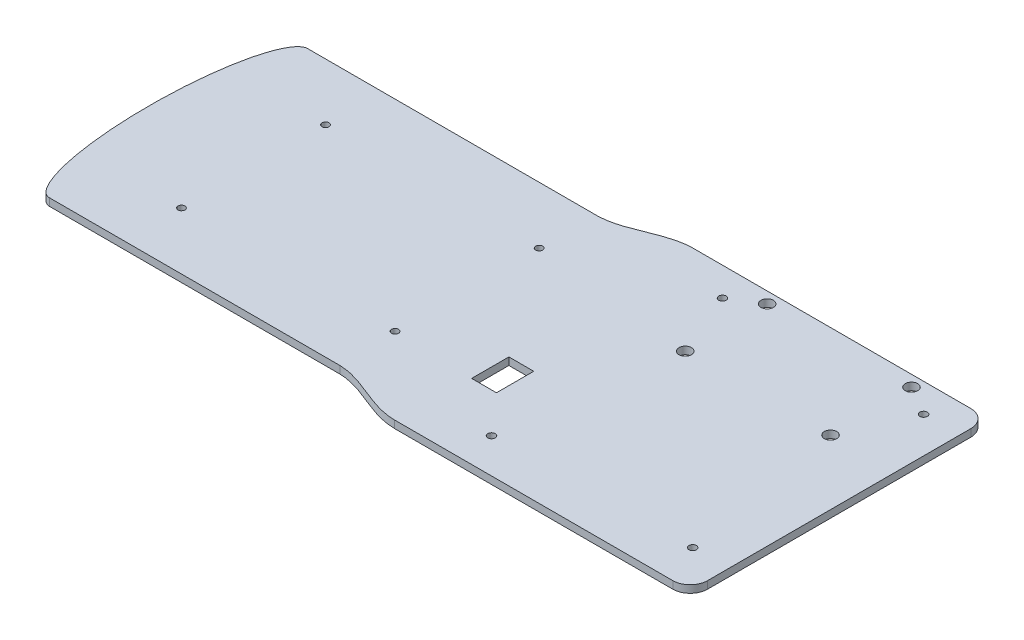
ISO-10303-21;
HEADER;
FILE_DESCRIPTION(('STEP AP214'),'2;1');
FILE_NAME('part.step','',(''),(''),'','','');
FILE_SCHEMA(('AUTOMOTIVE_DESIGN { 1 0 10303 214 1 1 1 1 }'));
ENDSEC;
DATA;
#1=APPLICATION_CONTEXT('core data for automotive mechanical design processes');
#2=APPLICATION_PROTOCOL_DEFINITION('international standard','automotive_design',2000,#1);
#3=PRODUCT_CONTEXT('',#1,'mechanical');
#4=PRODUCT('Part','Part','',(#3));
#5=PRODUCT_RELATED_PRODUCT_CATEGORY('part','',(#4));
#6=PRODUCT_DEFINITION_FORMATION('','',#4);
#7=PRODUCT_DEFINITION_CONTEXT('part definition',#1,'design');
#8=PRODUCT_DEFINITION('design','',#6,#7);
#9=PRODUCT_DEFINITION_SHAPE('','',#8);
#10=(LENGTH_UNIT() NAMED_UNIT(*) SI_UNIT(.MILLI.,.METRE.));
#11=(NAMED_UNIT(*) PLANE_ANGLE_UNIT() SI_UNIT($,.RADIAN.));
#12=(NAMED_UNIT(*) SI_UNIT($,.STERADIAN.) SOLID_ANGLE_UNIT());
#13=UNCERTAINTY_MEASURE_WITH_UNIT(LENGTH_MEASURE(1.E-05),#10,'distance_accuracy_value','');
#14=(GEOMETRIC_REPRESENTATION_CONTEXT(3) GLOBAL_UNCERTAINTY_ASSIGNED_CONTEXT((#13)) GLOBAL_UNIT_ASSIGNED_CONTEXT((#10,
#11,#12)) REPRESENTATION_CONTEXT('',''));
#15=CARTESIAN_POINT('',(0.,0.,0.));
#16=DIRECTION('',(0.,0.,1.));
#17=DIRECTION('',(1.,0.,0.));
#18=AXIS2_PLACEMENT_3D('',#15,#16,#17);
#19=CARTESIAN_POINT('',(139.,3.,-60.));
#20=DIRECTION('',(-1.,0.,0.));
#21=DIRECTION('',(0.,0.,1.));
#22=AXIS2_PLACEMENT_3D('',#19,#20,#21);
#23=PLANE('',#22);
#24=DIRECTION('',(0.,1.,0.));
#25=VECTOR('',#24,1.);
#26=CARTESIAN_POINT('',(139.,0.,-53.));
#27=LINE('',#26,#25);
#28=CARTESIAN_POINT('',(139.,0.,-53.));
#29=VERTEX_POINT('',#28);
#30=CARTESIAN_POINT('',(139.,3.,-53.));
#31=VERTEX_POINT('',#30);
#32=EDGE_CURVE('E203',#29,#31,#27,.T.);
#33=ORIENTED_EDGE('',*,*,#32,.T.);
#34=DIRECTION('',(0.,0.,-1.));
#35=VECTOR('',#34,1.);
#36=CARTESIAN_POINT('',(139.,3.,-60.));
#37=LINE('',#36,#35);
#38=CARTESIAN_POINT('',(139.,3.,53.));
#39=VERTEX_POINT('',#38);
#40=EDGE_CURVE('E313',#39,#31,#37,.T.);
#41=ORIENTED_EDGE('',*,*,#40,.F.);
#42=DIRECTION('',(0.,1.,0.));
#43=VECTOR('',#42,1.);
#44=CARTESIAN_POINT('',(139.,0.,53.));
#45=LINE('',#44,#43);
#46=CARTESIAN_POINT('',(139.,0.,53.));
#47=VERTEX_POINT('',#46);
#48=EDGE_CURVE('E220',#47,#39,#45,.T.);
#49=ORIENTED_EDGE('',*,*,#48,.F.);
#50=DIRECTION('',(0.,0.,-1.));
#51=VECTOR('',#50,1.);
#52=CARTESIAN_POINT('',(139.,0.,-60.));
#53=LINE('',#52,#51);
#54=EDGE_CURVE('E302',#47,#29,#53,.T.);
#55=ORIENTED_EDGE('',*,*,#54,.T.);
#56=EDGE_LOOP('',(#33,#41,#49,#55));
#57=FACE_BOUND('',#56,.T.);
#58=ADVANCED_FACE('F44',(#57),#23,.F.);
#59=CARTESIAN_POINT('',(-139.,3.,60.));
#60=DIRECTION('',(0.,0.,-1.));
#61=DIRECTION('',(-1.,0.,0.));
#62=AXIS2_PLACEMENT_3D('',#59,#60,#61);
#63=PLANE('',#62);
#64=DIRECTION('',(0.,1.,0.));
#65=VECTOR('',#64,1.);
#66=CARTESIAN_POINT('',(132.,0.,60.));
#67=LINE('',#66,#65);
#68=CARTESIAN_POINT('',(132.,0.,60.));
#69=VERTEX_POINT('',#68);
#70=CARTESIAN_POINT('',(132.,3.,60.));
#71=VERTEX_POINT('',#70);
#72=EDGE_CURVE('E215',#69,#71,#67,.T.);
#73=ORIENTED_EDGE('',*,*,#72,.T.);
#74=DIRECTION('',(1.,0.,0.));
#75=VECTOR('',#74,1.);
#76=CARTESIAN_POINT('',(-139.,3.,60.));
#77=LINE('',#76,#75);
#78=CARTESIAN_POINT('',(20.,3.,60.));
#79=VERTEX_POINT('',#78);
#80=EDGE_CURVE('E321',#79,#71,#77,.T.);
#81=ORIENTED_EDGE('',*,*,#80,.F.);
#82=DIRECTION('',(0.,1.,0.));
#83=VECTOR('',#82,1.);
#84=CARTESIAN_POINT('',(20.,0.,60.));
#85=LINE('',#84,#83);
#86=CARTESIAN_POINT('',(20.,0.,60.));
#87=VERTEX_POINT('',#86);
#88=EDGE_CURVE('E211',#87,#79,#85,.T.);
#89=ORIENTED_EDGE('',*,*,#88,.F.);
#90=DIRECTION('',(1.,0.,0.));
#91=VECTOR('',#90,1.);
#92=CARTESIAN_POINT('',(-139.,0.,60.));
#93=LINE('',#92,#91);
#94=EDGE_CURVE('E318',#87,#69,#93,.T.);
#95=ORIENTED_EDGE('',*,*,#94,.T.);
#96=EDGE_LOOP('',(#73,#81,#89,#95));
#97=FACE_BOUND('',#96,.T.);
#98=ADVANCED_FACE('F426',(#97),#63,.F.);
#99=CARTESIAN_POINT('',(0.,3.,0.));
#100=DIRECTION('',(0.,1.,0.));
#101=DIRECTION('',(0.,0.,1.));
#102=AXIS2_PLACEMENT_3D('',#99,#100,#101);
#103=PLANE('',#102);
#104=CARTESIAN_POINT('',(43.5000000000002,3.,-48.5));
#105=DIRECTION('',(0.,1.,0.));
#106=DIRECTION('',(0.,0.,1.));
#107=AXIS2_PLACEMENT_3D('',#104,#105,#106);
#108=CIRCLE('',#107,1.5);
#109=CARTESIAN_POINT('',(43.5000000000002,3.,-47.));
#110=VERTEX_POINT('',#109);
#111=EDGE_CURVE('E401',#110,#110,#108,.T.);
#112=ORIENTED_EDGE('',*,*,#111,.F.);
#113=EDGE_LOOP('',(#112));
#114=FACE_BOUND('',#113,.T.);
#115=CARTESIAN_POINT('',(45.0000000000002,3.,46.));
#116=DIRECTION('',(0.,1.,0.));
#117=DIRECTION('',(0.,0.,1.));
#118=AXIS2_PLACEMENT_3D('',#115,#116,#117);
#119=CIRCLE('',#118,1.5);
#120=CARTESIAN_POINT('',(45.0000000000002,3.,47.5));
#121=VERTEX_POINT('',#120);
#122=EDGE_CURVE('E388',#121,#121,#119,.T.);
#123=ORIENTED_EDGE('',*,*,#122,.F.);
#124=EDGE_LOOP('',(#123));
#125=FACE_BOUND('',#124,.T.);
#126=CARTESIAN_POINT('',(113.,3.,-22.5));
#127=DIRECTION('',(0.,1.,0.));
#128=DIRECTION('',(0.,0.,1.));
#129=AXIS2_PLACEMENT_3D('',#126,#127,#128);
#130=CIRCLE('',#129,2.5);
#131=CARTESIAN_POINT('',(113.,3.,-20.));
#132=VERTEX_POINT('',#131);
#133=EDGE_CURVE('E381',#132,#132,#130,.T.);
#134=ORIENTED_EDGE('',*,*,#133,.F.);
#135=EDGE_LOOP('',(#134));
#136=FACE_BOUND('',#135,.T.);
#137=CARTESIAN_POINT('',(54.5000000000002,3.,-22.5));
#138=DIRECTION('',(0.,1.,0.));
#139=DIRECTION('',(0.,0.,1.));
#140=AXIS2_PLACEMENT_3D('',#137,#138,#139);
#141=CIRCLE('',#140,2.5);
#142=CARTESIAN_POINT('',(54.5000000000002,3.,-20.));
#143=VERTEX_POINT('',#142);
#144=EDGE_CURVE('E387',#143,#143,#141,.T.);
#145=ORIENTED_EDGE('',*,*,#144,.F.);
#146=EDGE_LOOP('',(#145));
#147=FACE_BOUND('',#146,.T.);
#148=CARTESIAN_POINT('',(54.5000000000002,3.,-55.5));
#149=DIRECTION('',(0.,1.,0.));
#150=DIRECTION('',(0.,0.,1.));
#151=AXIS2_PLACEMENT_3D('',#148,#149,#150);
#152=CIRCLE('',#151,2.5);
#153=CARTESIAN_POINT('',(54.5000000000002,3.,-53.));
#154=VERTEX_POINT('',#153);
#155=EDGE_CURVE('E375',#154,#154,#152,.T.);
#156=ORIENTED_EDGE('',*,*,#155,.F.);
#157=EDGE_LOOP('',(#156));
#158=FACE_BOUND('',#157,.T.);
#159=CARTESIAN_POINT('',(124.5,3.,44.5));
#160=DIRECTION('',(0.,1.,0.));
#161=DIRECTION('',(0.,0.,1.));
#162=AXIS2_PLACEMENT_3D('',#159,#160,#161);
#163=CIRCLE('',#162,1.49999999999998);
#164=CARTESIAN_POINT('',(124.5,3.,46.));
#165=VERTEX_POINT('',#164);
#166=EDGE_CURVE('E370',#165,#165,#163,.T.);
#167=ORIENTED_EDGE('',*,*,#166,.F.);
#168=EDGE_LOOP('',(#167));
#169=FACE_BOUND('',#168,.T.);
#170=CARTESIAN_POINT('',(124.5,3.,-48.5));
#171=DIRECTION('',(0.,1.,0.));
#172=DIRECTION('',(0.,0.,1.));
#173=AXIS2_PLACEMENT_3D('',#170,#171,#172);
#174=CIRCLE('',#173,1.49999999999998);
#175=CARTESIAN_POINT('',(124.5,3.,-47.));
#176=VERTEX_POINT('',#175);
#177=EDGE_CURVE('E365',#176,#176,#174,.T.);
#178=ORIENTED_EDGE('',*,*,#177,.F.);
#179=EDGE_LOOP('',(#178));
#180=FACE_BOUND('',#179,.T.);
#181=CARTESIAN_POINT('',(112.6,3.,-55.5));
#182=DIRECTION('',(0.,1.,0.));
#183=DIRECTION('',(0.,0.,1.));
#184=AXIS2_PLACEMENT_3D('',#181,#182,#183);
#185=CIRCLE('',#184,2.5);
#186=CARTESIAN_POINT('',(112.6,3.,-53.));
#187=VERTEX_POINT('',#186);
#188=EDGE_CURVE('E360',#187,#187,#185,.T.);
#189=ORIENTED_EDGE('',*,*,#188,.F.);
#190=EDGE_LOOP('',(#189));
#191=FACE_BOUND('',#190,.T.);
#192=DIRECTION('',(0.,0.,1.));
#193=VECTOR('',#192,1.);
#194=CARTESIAN_POINT('',(21.0000000000002,3.,15.));
#195=LINE('',#194,#193);
#196=CARTESIAN_POINT('',(21.0000000000002,3.,15.));
#197=VERTEX_POINT('',#196);
#198=CARTESIAN_POINT('',(21.0000000000002,3.,30.));
#199=VERTEX_POINT('',#198);
#200=EDGE_CURVE('E61',#197,#199,#195,.T.);
#201=ORIENTED_EDGE('',*,*,#200,.F.);
#202=DIRECTION('',(-1.,0.,0.));
#203=VECTOR('',#202,1.);
#204=CARTESIAN_POINT('',(21.0000000000002,3.,15.));
#205=LINE('',#204,#203);
#206=CARTESIAN_POINT('',(31.0000000000002,3.,15.));
#207=VERTEX_POINT('',#206);
#208=EDGE_CURVE('E168',#207,#197,#205,.T.);
#209=ORIENTED_EDGE('',*,*,#208,.F.);
#210=DIRECTION('',(0.,0.,-1.));
#211=VECTOR('',#210,1.);
#212=CARTESIAN_POINT('',(31.0000000000002,3.,15.));
#213=LINE('',#212,#211);
#214=CARTESIAN_POINT('',(31.0000000000002,3.,30.));
#215=VERTEX_POINT('',#214);
#216=EDGE_CURVE('E150',#215,#207,#213,.T.);
#217=ORIENTED_EDGE('',*,*,#216,.F.);
#218=DIRECTION('',(1.,0.,0.));
#219=VECTOR('',#218,1.);
#220=CARTESIAN_POINT('',(21.0000000000002,3.,30.));
#221=LINE('',#220,#219);
#222=EDGE_CURVE('E160',#199,#215,#221,.T.);
#223=ORIENTED_EDGE('',*,*,#222,.F.);
#224=EDGE_LOOP('',(#201,#209,#217,#223));
#225=FACE_BOUND('',#224,.T.);
#226=CARTESIAN_POINT('',(-96.85109,3.,28.96802));
#227=DIRECTION('',(0.,1.,0.));
#228=DIRECTION('',(0.,0.,1.));
#229=AXIS2_PLACEMENT_3D('',#226,#227,#228);
#230=CIRCLE('',#229,1.39979);
#231=CARTESIAN_POINT('',(-96.85109,3.,30.36781));
#232=VERTEX_POINT('',#231);
#233=EDGE_CURVE('E187',#232,#232,#230,.T.);
#234=ORIENTED_EDGE('',*,*,#233,.F.);
#235=EDGE_LOOP('',(#234));
#236=FACE_BOUND('',#235,.T.);
#237=CARTESIAN_POINT('',(-10.85223,3.,-29.03265));
#238=DIRECTION('',(0.,1.,0.));
#239=DIRECTION('',(0.,0.,1.));
#240=AXIS2_PLACEMENT_3D('',#237,#238,#239);
#241=CIRCLE('',#240,1.39979);
#242=CARTESIAN_POINT('',(-10.85223,3.,-27.63286));
#243=VERTEX_POINT('',#242);
#244=EDGE_CURVE('E186',#243,#243,#241,.T.);
#245=ORIENTED_EDGE('',*,*,#244,.F.);
#246=EDGE_LOOP('',(#245));
#247=FACE_BOUND('',#246,.T.);
#248=CARTESIAN_POINT('',(-10.8511,3.,28.96784));
#249=DIRECTION('',(0.,1.,0.));
#250=DIRECTION('',(0.,0.,1.));
#251=AXIS2_PLACEMENT_3D('',#248,#249,#250);
#252=CIRCLE('',#251,1.39979);
#253=CARTESIAN_POINT('',(-10.8511,3.,30.36763));
#254=VERTEX_POINT('',#253);
#255=EDGE_CURVE('E178',#254,#254,#252,.T.);
#256=ORIENTED_EDGE('',*,*,#255,.F.);
#257=EDGE_LOOP('',(#256));
#258=FACE_BOUND('',#257,.T.);
#259=CARTESIAN_POINT('',(-96.85129,3.,-29.0311));
#260=DIRECTION('',(0.,1.,0.));
#261=DIRECTION('',(0.,0.,1.));
#262=AXIS2_PLACEMENT_3D('',#259,#260,#261);
#263=CIRCLE('',#262,1.39978999999999);
#264=CARTESIAN_POINT('',(-96.85129,3.,-27.63131));
#265=VERTEX_POINT('',#264);
#266=EDGE_CURVE('E191',#265,#265,#263,.T.);
#267=ORIENTED_EDGE('',*,*,#266,.F.);
#268=EDGE_LOOP('',(#267));
#269=FACE_BOUND('',#268,.T.);
#270=CARTESIAN_POINT('',(132.,3.,-53.));
#271=DIRECTION('',(0.,-1.,0.));
#272=DIRECTION('',(0.,0.,1.));
#273=AXIS2_PLACEMENT_3D('',#270,#271,#272);
#274=CIRCLE('',#273,7.00000000000001);
#275=CARTESIAN_POINT('',(132.,3.,-60.));
#276=VERTEX_POINT('',#275);
#277=EDGE_CURVE('E204',#276,#31,#274,.T.);
#278=ORIENTED_EDGE('',*,*,#277,.F.);
#279=DIRECTION('',(-1.,0.,0.));
#280=VECTOR('',#279,1.);
#281=CARTESIAN_POINT('',(-139.,3.,-60.));
#282=LINE('',#281,#280);
#283=CARTESIAN_POINT('',(20.,3.,-60.));
#284=VERTEX_POINT('',#283);
#285=EDGE_CURVE('E317',#276,#284,#282,.T.);
#286=ORIENTED_EDGE('',*,*,#285,.T.);
#287=CARTESIAN_POINT('',(-10.,3.,-52.));
#288=CARTESIAN_POINT('',(0.641218660403758,3.,-52.3672232546946));
#289=CARTESIAN_POINT('',(9.37669372133116,3.,-59.9199275905151));
#290=CARTESIAN_POINT('',(20.,3.,-60.));
#291=B_SPLINE_CURVE_WITH_KNOTS('',3,(#287,#288,#289,#290),.UNSPECIFIED.,.F.,.F.,(4,4),(0.,1.),.UNSPECIFIED.);
#292=CARTESIAN_POINT('',(-10.,3.,-52.));
#293=VERTEX_POINT('',#292);
#294=EDGE_CURVE('E237',#293,#284,#291,.T.);
#295=ORIENTED_EDGE('',*,*,#294,.F.);
#296=DIRECTION('',(1.,0.,0.));
#297=VECTOR('',#296,1.);
#298=CARTESIAN_POINT('',(-10.,3.,-52.));
#299=LINE('',#298,#297);
#300=CARTESIAN_POINT('',(-127.,3.,-52.));
#301=VERTEX_POINT('',#300);
#302=EDGE_CURVE('E295',#301,#293,#299,.T.);
#303=ORIENTED_EDGE('',*,*,#302,.F.);
#304=CARTESIAN_POINT('',(-127.,3.,0.));
#305=DIRECTION('',(0.,1.,0.));
#306=DIRECTION('',(0.,0.,1.));
#307=AXIS2_PLACEMENT_3D('',#304,#305,#306);
#308=ELLIPSE('',#307,52.,12.);
#309=CARTESIAN_POINT('',(-127.,3.,52.));
#310=VERTEX_POINT('',#309);
#311=EDGE_CURVE('E278',#301,#310,#308,.T.);
#312=ORIENTED_EDGE('',*,*,#311,.T.);
#313=DIRECTION('',(-1.,0.,0.));
#314=VECTOR('',#313,1.);
#315=CARTESIAN_POINT('',(-139.,3.,52.));
#316=LINE('',#315,#314);
#317=CARTESIAN_POINT('',(-10.,3.,52.));
#318=VERTEX_POINT('',#317);
#319=EDGE_CURVE('E299',#318,#310,#316,.T.);
#320=ORIENTED_EDGE('',*,*,#319,.F.);
#321=CARTESIAN_POINT('',(20.,3.,60.));
#322=CARTESIAN_POINT('',(9.37669372133118,3.,59.9199275905152));
#323=CARTESIAN_POINT('',(0.641218660403772,3.,52.3672232546946));
#324=CARTESIAN_POINT('',(-10.,3.,52.));
#325=B_SPLINE_CURVE_WITH_KNOTS('',3,(#321,#322,#323,#324),.UNSPECIFIED.,.F.,.F.,(4,4),(0.,1.),.UNSPECIFIED.);
#326=EDGE_CURVE('E268',#79,#318,#325,.T.);
#327=ORIENTED_EDGE('',*,*,#326,.F.);
#328=ORIENTED_EDGE('',*,*,#80,.T.);
#329=CARTESIAN_POINT('',(132.,3.,53.));
#330=DIRECTION('',(0.,-1.,0.));
#331=DIRECTION('',(0.,0.,-1.));
#332=AXIS2_PLACEMENT_3D('',#329,#330,#331);
#333=CIRCLE('',#332,7.00000000000001);
#334=EDGE_CURVE('E207',#39,#71,#333,.T.);
#335=ORIENTED_EDGE('',*,*,#334,.F.);
#336=ORIENTED_EDGE('',*,*,#40,.T.);
#337=EDGE_LOOP('',(#278,#286,#295,#303,#312,#320,#327,#328,#335,#336));
#338=FACE_BOUND('',#337,.T.);
#339=ADVANCED_FACE('F165',(#114,#125,#136,#147,#158,#169,#180,#191,#225,#236,#247,#258,#269,
#338),#103,.T.);
#340=CARTESIAN_POINT('',(0.,0.,0.));
#341=DIRECTION('',(0.,1.,0.));
#342=DIRECTION('',(0.,0.,1.));
#343=AXIS2_PLACEMENT_3D('',#340,#341,#342);
#344=PLANE('',#343);
#345=CARTESIAN_POINT('',(43.5000000000002,0.,-48.5));
#346=DIRECTION('',(0.,1.,0.));
#347=DIRECTION('',(0.,0.,1.));
#348=AXIS2_PLACEMENT_3D('',#345,#346,#347);
#349=CIRCLE('',#348,1.5);
#350=CARTESIAN_POINT('',(43.5000000000002,0.,-47.));
#351=VERTEX_POINT('',#350);
#352=EDGE_CURVE('E47',#351,#351,#349,.T.);
#353=ORIENTED_EDGE('',*,*,#352,.T.);
#354=EDGE_LOOP('',(#353));
#355=FACE_BOUND('',#354,.T.);
#356=CARTESIAN_POINT('',(45.0000000000002,0.,46.));
#357=DIRECTION('',(0.,1.,0.));
#358=DIRECTION('',(0.,0.,1.));
#359=AXIS2_PLACEMENT_3D('',#356,#357,#358);
#360=CIRCLE('',#359,1.5);
#361=CARTESIAN_POINT('',(45.0000000000002,0.,47.5));
#362=VERTEX_POINT('',#361);
#363=EDGE_CURVE('E384',#362,#362,#360,.T.);
#364=ORIENTED_EDGE('',*,*,#363,.T.);
#365=EDGE_LOOP('',(#364));
#366=FACE_BOUND('',#365,.T.);
#367=CARTESIAN_POINT('',(113.,0.,-22.5));
#368=DIRECTION('',(0.,1.,0.));
#369=DIRECTION('',(0.,0.,1.));
#370=AXIS2_PLACEMENT_3D('',#367,#368,#369);
#371=CIRCLE('',#370,2.5);
#372=CARTESIAN_POINT('',(113.,0.,-20.));
#373=VERTEX_POINT('',#372);
#374=EDGE_CURVE('E380',#373,#373,#371,.T.);
#375=ORIENTED_EDGE('',*,*,#374,.T.);
#376=EDGE_LOOP('',(#375));
#377=FACE_BOUND('',#376,.T.);
#378=CARTESIAN_POINT('',(54.5000000000002,0.,-22.5));
#379=DIRECTION('',(0.,1.,0.));
#380=DIRECTION('',(0.,0.,1.));
#381=AXIS2_PLACEMENT_3D('',#378,#379,#380);
#382=CIRCLE('',#381,2.5);
#383=CARTESIAN_POINT('',(54.5000000000002,0.,-20.));
#384=VERTEX_POINT('',#383);
#385=EDGE_CURVE('E376',#384,#384,#382,.T.);
#386=ORIENTED_EDGE('',*,*,#385,.T.);
#387=EDGE_LOOP('',(#386));
#388=FACE_BOUND('',#387,.T.);
#389=CARTESIAN_POINT('',(54.5000000000002,0.,-55.5));
#390=DIRECTION('',(0.,1.,0.));
#391=DIRECTION('',(0.,0.,1.));
#392=AXIS2_PLACEMENT_3D('',#389,#390,#391);
#393=CIRCLE('',#392,2.5);
#394=CARTESIAN_POINT('',(54.5000000000002,0.,-53.));
#395=VERTEX_POINT('',#394);
#396=EDGE_CURVE('E371',#395,#395,#393,.T.);
#397=ORIENTED_EDGE('',*,*,#396,.T.);
#398=EDGE_LOOP('',(#397));
#399=FACE_BOUND('',#398,.T.);
#400=CARTESIAN_POINT('',(124.5,0.,44.5));
#401=DIRECTION('',(0.,1.,0.));
#402=DIRECTION('',(0.,0.,1.));
#403=AXIS2_PLACEMENT_3D('',#400,#401,#402);
#404=CIRCLE('',#403,1.49999999999998);
#405=CARTESIAN_POINT('',(124.5,0.,46.));
#406=VERTEX_POINT('',#405);
#407=EDGE_CURVE('E366',#406,#406,#404,.T.);
#408=ORIENTED_EDGE('',*,*,#407,.T.);
#409=EDGE_LOOP('',(#408));
#410=FACE_BOUND('',#409,.T.);
#411=CARTESIAN_POINT('',(124.5,0.,-48.5));
#412=DIRECTION('',(0.,1.,0.));
#413=DIRECTION('',(0.,0.,1.));
#414=AXIS2_PLACEMENT_3D('',#411,#412,#413);
#415=CIRCLE('',#414,1.49999999999998);
#416=CARTESIAN_POINT('',(124.5,0.,-47.));
#417=VERTEX_POINT('',#416);
#418=EDGE_CURVE('E361',#417,#417,#415,.T.);
#419=ORIENTED_EDGE('',*,*,#418,.T.);
#420=EDGE_LOOP('',(#419));
#421=FACE_BOUND('',#420,.T.);
#422=CARTESIAN_POINT('',(112.6,0.,-55.5));
#423=DIRECTION('',(0.,1.,0.));
#424=DIRECTION('',(0.,0.,1.));
#425=AXIS2_PLACEMENT_3D('',#422,#423,#424);
#426=CIRCLE('',#425,2.5);
#427=CARTESIAN_POINT('',(112.6,0.,-53.));
#428=VERTEX_POINT('',#427);
#429=EDGE_CURVE('E356',#428,#428,#426,.T.);
#430=ORIENTED_EDGE('',*,*,#429,.T.);
#431=EDGE_LOOP('',(#430));
#432=FACE_BOUND('',#431,.T.);
#433=DIRECTION('',(-1.,0.,0.));
#434=VECTOR('',#433,1.);
#435=CARTESIAN_POINT('',(0.,0.,15.));
#436=LINE('',#435,#434);
#437=CARTESIAN_POINT('',(31.0000000000002,0.,15.));
#438=VERTEX_POINT('',#437);
#439=CARTESIAN_POINT('',(21.0000000000002,0.,15.));
#440=VERTEX_POINT('',#439);
#441=EDGE_CURVE('E53',#438,#440,#436,.T.);
#442=ORIENTED_EDGE('',*,*,#441,.T.);
#443=DIRECTION('',(0.,0.,1.));
#444=VECTOR('',#443,1.);
#445=CARTESIAN_POINT('',(21.0000000000002,0.,0.));
#446=LINE('',#445,#444);
#447=CARTESIAN_POINT('',(21.0000000000002,0.,30.));
#448=VERTEX_POINT('',#447);
#449=EDGE_CURVE('E11',#440,#448,#446,.T.);
#450=ORIENTED_EDGE('',*,*,#449,.T.);
#451=DIRECTION('',(1.,0.,0.));
#452=VECTOR('',#451,1.);
#453=CARTESIAN_POINT('',(0.,0.,30.));
#454=LINE('',#453,#452);
#455=CARTESIAN_POINT('',(31.0000000000002,0.,30.));
#456=VERTEX_POINT('',#455);
#457=EDGE_CURVE('E325',#448,#456,#454,.T.);
#458=ORIENTED_EDGE('',*,*,#457,.T.);
#459=DIRECTION('',(0.,0.,-1.));
#460=VECTOR('',#459,1.);
#461=CARTESIAN_POINT('',(31.0000000000002,0.,0.));
#462=LINE('',#461,#460);
#463=EDGE_CURVE('E153',#456,#438,#462,.T.);
#464=ORIENTED_EDGE('',*,*,#463,.T.);
#465=EDGE_LOOP('',(#442,#450,#458,#464));
#466=FACE_BOUND('',#465,.T.);
#467=CARTESIAN_POINT('',(-96.85109,0.,28.96802));
#468=DIRECTION('',(0.,1.,0.));
#469=DIRECTION('',(0.,0.,1.));
#470=AXIS2_PLACEMENT_3D('',#467,#468,#469);
#471=CIRCLE('',#470,1.39979);
#472=CARTESIAN_POINT('',(-96.85109,0.,30.36781));
#473=VERTEX_POINT('',#472);
#474=EDGE_CURVE('E223',#473,#473,#471,.T.);
#475=ORIENTED_EDGE('',*,*,#474,.T.);
#476=EDGE_LOOP('',(#475));
#477=FACE_BOUND('',#476,.T.);
#478=CARTESIAN_POINT('',(-10.85223,0.,-29.03265));
#479=DIRECTION('',(0.,1.,0.));
#480=DIRECTION('',(0.,0.,1.));
#481=AXIS2_PLACEMENT_3D('',#478,#479,#480);
#482=CIRCLE('',#481,1.39979);
#483=CARTESIAN_POINT('',(-10.85223,0.,-27.63286));
#484=VERTEX_POINT('',#483);
#485=EDGE_CURVE('E342',#484,#484,#482,.T.);
#486=ORIENTED_EDGE('',*,*,#485,.T.);
#487=EDGE_LOOP('',(#486));
#488=FACE_BOUND('',#487,.T.);
#489=CARTESIAN_POINT('',(-10.8511,0.,28.96784));
#490=DIRECTION('',(0.,1.,0.));
#491=DIRECTION('',(0.,0.,1.));
#492=AXIS2_PLACEMENT_3D('',#489,#490,#491);
#493=CIRCLE('',#492,1.39979);
#494=CARTESIAN_POINT('',(-10.8511,0.,30.36763));
#495=VERTEX_POINT('',#494);
#496=EDGE_CURVE('E338',#495,#495,#493,.T.);
#497=ORIENTED_EDGE('',*,*,#496,.T.);
#498=EDGE_LOOP('',(#497));
#499=FACE_BOUND('',#498,.T.);
#500=CARTESIAN_POINT('',(-96.85129,0.,-29.0311));
#501=DIRECTION('',(0.,1.,0.));
#502=DIRECTION('',(0.,0.,1.));
#503=AXIS2_PLACEMENT_3D('',#500,#501,#502);
#504=CIRCLE('',#503,1.39978999999999);
#505=CARTESIAN_POINT('',(-96.85129,0.,-27.63131));
#506=VERTEX_POINT('',#505);
#507=EDGE_CURVE('E198',#506,#506,#504,.T.);
#508=ORIENTED_EDGE('',*,*,#507,.T.);
#509=EDGE_LOOP('',(#508));
#510=FACE_BOUND('',#509,.T.);
#511=DIRECTION('',(-1.,0.,0.));
#512=VECTOR('',#511,1.);
#513=CARTESIAN_POINT('',(-139.,0.,-60.));
#514=LINE('',#513,#512);
#515=CARTESIAN_POINT('',(132.,0.,-60.));
#516=VERTEX_POINT('',#515);
#517=CARTESIAN_POINT('',(20.,0.,-60.));
#518=VERTEX_POINT('',#517);
#519=EDGE_CURVE('E329',#516,#518,#514,.T.);
#520=ORIENTED_EDGE('',*,*,#519,.F.);
#521=CARTESIAN_POINT('',(132.,0.,-53.));
#522=DIRECTION('',(0.,-1.,0.));
#523=DIRECTION('',(0.,0.,1.));
#524=AXIS2_PLACEMENT_3D('',#521,#522,#523);
#525=CIRCLE('',#524,7.00000000000001);
#526=EDGE_CURVE('E199',#516,#29,#525,.T.);
#527=ORIENTED_EDGE('',*,*,#526,.T.);
#528=ORIENTED_EDGE('',*,*,#54,.F.);
#529=CARTESIAN_POINT('',(132.,0.,53.));
#530=DIRECTION('',(0.,-1.,0.));
#531=DIRECTION('',(0.,0.,-1.));
#532=AXIS2_PLACEMENT_3D('',#529,#530,#531);
#533=CIRCLE('',#532,7.00000000000001);
#534=EDGE_CURVE('E219',#47,#69,#533,.T.);
#535=ORIENTED_EDGE('',*,*,#534,.T.);
#536=ORIENTED_EDGE('',*,*,#94,.F.);
#537=CARTESIAN_POINT('',(20.,0.,60.));
#538=CARTESIAN_POINT('',(9.37669372133118,0.,59.9199275905152));
#539=CARTESIAN_POINT('',(0.641218660403772,0.,52.3672232546946));
#540=CARTESIAN_POINT('',(-10.,0.,52.));
#541=B_SPLINE_CURVE_WITH_KNOTS('',3,(#537,#538,#539,#540),.UNSPECIFIED.,.F.,.F.,(4,4),(0.,1.),.UNSPECIFIED.);
#542=CARTESIAN_POINT('',(-10.,0.,52.));
#543=VERTEX_POINT('',#542);
#544=EDGE_CURVE('E260',#87,#543,#541,.T.);
#545=ORIENTED_EDGE('',*,*,#544,.T.);
#546=DIRECTION('',(-1.,0.,0.));
#547=VECTOR('',#546,1.);
#548=CARTESIAN_POINT('',(-139.,0.,52.));
#549=LINE('',#548,#547);
#550=CARTESIAN_POINT('',(-127.,0.,52.));
#551=VERTEX_POINT('',#550);
#552=EDGE_CURVE('E306',#543,#551,#549,.T.);
#553=ORIENTED_EDGE('',*,*,#552,.T.);
#554=CARTESIAN_POINT('',(-127.,0.,0.));
#555=DIRECTION('',(0.,1.,0.));
#556=DIRECTION('',(0.,0.,1.));
#557=AXIS2_PLACEMENT_3D('',#554,#555,#556);
#558=ELLIPSE('',#557,52.,12.);
#559=CARTESIAN_POINT('',(-127.,0.,-52.));
#560=VERTEX_POINT('',#559);
#561=EDGE_CURVE('E279',#560,#551,#558,.T.);
#562=ORIENTED_EDGE('',*,*,#561,.F.);
#563=DIRECTION('',(1.,0.,0.));
#564=VECTOR('',#563,1.);
#565=CARTESIAN_POINT('',(-10.,0.,-52.));
#566=LINE('',#565,#564);
#567=CARTESIAN_POINT('',(-10.,0.,-52.));
#568=VERTEX_POINT('',#567);
#569=EDGE_CURVE('E290',#560,#568,#566,.T.);
#570=ORIENTED_EDGE('',*,*,#569,.T.);
#571=CARTESIAN_POINT('',(-10.,0.,-52.));
#572=CARTESIAN_POINT('',(0.641218660403758,0.,-52.3672232546946));
#573=CARTESIAN_POINT('',(9.37669372133116,0.,-59.9199275905151));
#574=CARTESIAN_POINT('',(20.,0.,-60.));
#575=B_SPLINE_CURVE_WITH_KNOTS('',3,(#571,#572,#573,#574),.UNSPECIFIED.,.F.,.F.,(4,4),(0.,1.),.UNSPECIFIED.);
#576=EDGE_CURVE('E229',#568,#518,#575,.T.);
#577=ORIENTED_EDGE('',*,*,#576,.T.);
#578=EDGE_LOOP('',(#520,#527,#528,#535,#536,#545,#553,#562,#570,#577));
#579=FACE_BOUND('',#578,.T.);
#580=ADVANCED_FACE('F425',(#355,#366,#377,#388,#399,#410,#421,#432,#466,#477,#488,#499,#510,
#579),#344,.F.);
#581=CARTESIAN_POINT('',(-139.,0.,52.));
#582=DIRECTION('',(0.,0.,-1.));
#583=DIRECTION('',(-1.,0.,0.));
#584=AXIS2_PLACEMENT_3D('',#581,#582,#583);
#585=PLANE('',#584);
#586=DIRECTION('',(0.,1.,0.));
#587=VECTOR('',#586,1.);
#588=CARTESIAN_POINT('',(-127.,0.,52.));
#589=LINE('',#588,#587);
#590=EDGE_CURVE('E272',#551,#310,#589,.T.);
#591=ORIENTED_EDGE('',*,*,#590,.F.);
#592=ORIENTED_EDGE('',*,*,#552,.F.);
#593=DIRECTION('',(0.,1.,0.));
#594=VECTOR('',#593,1.);
#595=CARTESIAN_POINT('',(-10.,0.,52.));
#596=LINE('',#595,#594);
#597=EDGE_CURVE('E289',#543,#318,#596,.T.);
#598=ORIENTED_EDGE('',*,*,#597,.T.);
#599=ORIENTED_EDGE('',*,*,#319,.T.);
#600=EDGE_LOOP('',(#591,#592,#598,#599));
#601=FACE_BOUND('',#600,.T.);
#602=ADVANCED_FACE('F433',(#601),#585,.F.);
#603=CARTESIAN_POINT('',(-139.,3.,-60.));
#604=DIRECTION('',(0.,0.,1.));
#605=DIRECTION('',(1.,0.,0.));
#606=AXIS2_PLACEMENT_3D('',#603,#604,#605);
#607=PLANE('',#606);
#608=ORIENTED_EDGE('',*,*,#285,.F.);
#609=DIRECTION('',(0.,1.,0.));
#610=VECTOR('',#609,1.);
#611=CARTESIAN_POINT('',(132.,0.,-60.));
#612=LINE('',#611,#610);
#613=EDGE_CURVE('E208',#516,#276,#612,.T.);
#614=ORIENTED_EDGE('',*,*,#613,.F.);
#615=ORIENTED_EDGE('',*,*,#519,.T.);
#616=DIRECTION('',(0.,1.,0.));
#617=VECTOR('',#616,1.);
#618=CARTESIAN_POINT('',(20.,0.,-60.));
#619=LINE('',#618,#617);
#620=EDGE_CURVE('E236',#518,#284,#619,.T.);
#621=ORIENTED_EDGE('',*,*,#620,.T.);
#622=EDGE_LOOP('',(#608,#614,#615,#621));
#623=FACE_BOUND('',#622,.T.);
#624=ADVANCED_FACE('F464',(#623),#607,.F.);
#625=CARTESIAN_POINT('',(-10.,0.,-52.));
#626=DIRECTION('',(0.,0.,1.));
#627=DIRECTION('',(1.,0.,0.));
#628=AXIS2_PLACEMENT_3D('',#625,#626,#627);
#629=PLANE('',#628);
#630=ORIENTED_EDGE('',*,*,#569,.F.);
#631=DIRECTION('',(0.,1.,0.));
#632=VECTOR('',#631,1.);
#633=CARTESIAN_POINT('',(-127.,0.,-52.));
#634=LINE('',#633,#632);
#635=EDGE_CURVE('E283',#560,#301,#634,.T.);
#636=ORIENTED_EDGE('',*,*,#635,.T.);
#637=ORIENTED_EDGE('',*,*,#302,.T.);
#638=DIRECTION('',(0.,1.,0.));
#639=VECTOR('',#638,1.);
#640=CARTESIAN_POINT('',(-10.,0.,-52.));
#641=LINE('',#640,#639);
#642=EDGE_CURVE('E294',#568,#293,#641,.T.);
#643=ORIENTED_EDGE('',*,*,#642,.F.);
#644=EDGE_LOOP('',(#630,#636,#637,#643));
#645=FACE_BOUND('',#644,.T.);
#646=ADVANCED_FACE('F480',(#645),#629,.F.);
#647=DIRECTION('',(0.,1.,0.));
#648=VECTOR('',#647,1.);
#649=SURFACE_OF_LINEAR_EXTRUSION('',#558,#648);
#650=ORIENTED_EDGE('',*,*,#311,.F.);
#651=ORIENTED_EDGE('',*,*,#635,.F.);
#652=ORIENTED_EDGE('',*,*,#561,.T.);
#653=ORIENTED_EDGE('',*,*,#590,.T.);
#654=EDGE_LOOP('',(#650,#651,#652,#653));
#655=FACE_BOUND('',#654,.T.);
#656=ADVANCED_FACE('F250',(#655),#649,.T.);
#657=DIRECTION('',(0.,1.,0.));
#658=VECTOR('',#657,1.);
#659=SURFACE_OF_LINEAR_EXTRUSION('',#575,#658);
#660=ORIENTED_EDGE('',*,*,#294,.T.);
#661=ORIENTED_EDGE('',*,*,#620,.F.);
#662=ORIENTED_EDGE('',*,*,#576,.F.);
#663=ORIENTED_EDGE('',*,*,#642,.T.);
#664=EDGE_LOOP('',(#660,#661,#662,#663));
#665=FACE_BOUND('',#664,.T.);
#666=ADVANCED_FACE('F245',(#665),#659,.F.);
#667=DIRECTION('',(0.,1.,0.));
#668=VECTOR('',#667,1.);
#669=SURFACE_OF_LINEAR_EXTRUSION('',#541,#668);
#670=ORIENTED_EDGE('',*,*,#326,.T.);
#671=ORIENTED_EDGE('',*,*,#597,.F.);
#672=ORIENTED_EDGE('',*,*,#544,.F.);
#673=ORIENTED_EDGE('',*,*,#88,.T.);
#674=EDGE_LOOP('',(#670,#671,#672,#673));
#675=FACE_BOUND('',#674,.T.);
#676=ADVANCED_FACE('F249',(#675),#669,.F.);
#677=CARTESIAN_POINT('',(132.,0.,53.));
#678=DIRECTION('',(0.,1.,0.));
#679=DIRECTION('',(0.,0.,1.));
#680=AXIS2_PLACEMENT_3D('',#677,#678,#679);
#681=CYLINDRICAL_SURFACE('',#680,7.00000000000001);
#682=ORIENTED_EDGE('',*,*,#334,.T.);
#683=ORIENTED_EDGE('',*,*,#72,.F.);
#684=ORIENTED_EDGE('',*,*,#534,.F.);
#685=ORIENTED_EDGE('',*,*,#48,.T.);
#686=EDGE_LOOP('',(#682,#683,#684,#685));
#687=FACE_BOUND('',#686,.T.);
#688=ADVANCED_FACE('F252',(#687),#681,.T.);
#689=CARTESIAN_POINT('',(132.,0.,-53.));
#690=DIRECTION('',(0.,1.,0.));
#691=DIRECTION('',(0.,0.,1.));
#692=AXIS2_PLACEMENT_3D('',#689,#690,#691);
#693=CYLINDRICAL_SURFACE('',#692,7.00000000000001);
#694=ORIENTED_EDGE('',*,*,#277,.T.);
#695=ORIENTED_EDGE('',*,*,#32,.F.);
#696=ORIENTED_EDGE('',*,*,#526,.F.);
#697=ORIENTED_EDGE('',*,*,#613,.T.);
#698=EDGE_LOOP('',(#694,#695,#696,#697));
#699=FACE_BOUND('',#698,.T.);
#700=ADVANCED_FACE('F462',(#699),#693,.T.);
#701=CARTESIAN_POINT('',(-96.85129,-7.,-29.0311));
#702=DIRECTION('',(0.,1.,0.));
#703=DIRECTION('',(0.,0.,1.));
#704=AXIS2_PLACEMENT_3D('',#701,#702,#703);
#705=CYLINDRICAL_SURFACE('',#704,1.39978999999999);
#706=ORIENTED_EDGE('',*,*,#266,.T.);
#707=EDGE_LOOP('',(#706));
#708=FACE_BOUND('',#707,.T.);
#709=ORIENTED_EDGE('',*,*,#507,.F.);
#710=EDGE_LOOP('',(#709));
#711=FACE_BOUND('',#710,.T.);
#712=ADVANCED_FACE('F519',(#708,#711),#705,.F.);
#713=CARTESIAN_POINT('',(-10.8511,-7.,28.96784));
#714=DIRECTION('',(0.,1.,0.));
#715=DIRECTION('',(0.,0.,1.));
#716=AXIS2_PLACEMENT_3D('',#713,#714,#715);
#717=CYLINDRICAL_SURFACE('',#716,1.39979);
#718=ORIENTED_EDGE('',*,*,#255,.T.);
#719=EDGE_LOOP('',(#718));
#720=FACE_BOUND('',#719,.T.);
#721=ORIENTED_EDGE('',*,*,#496,.F.);
#722=EDGE_LOOP('',(#721));
#723=FACE_BOUND('',#722,.T.);
#724=ADVANCED_FACE('F528',(#720,#723),#717,.F.);
#725=CARTESIAN_POINT('',(-10.85223,-7.,-29.03265));
#726=DIRECTION('',(0.,1.,0.));
#727=DIRECTION('',(0.,0.,1.));
#728=AXIS2_PLACEMENT_3D('',#725,#726,#727);
#729=CYLINDRICAL_SURFACE('',#728,1.39979);
#730=ORIENTED_EDGE('',*,*,#244,.T.);
#731=EDGE_LOOP('',(#730));
#732=FACE_BOUND('',#731,.T.);
#733=ORIENTED_EDGE('',*,*,#485,.F.);
#734=EDGE_LOOP('',(#733));
#735=FACE_BOUND('',#734,.T.);
#736=ADVANCED_FACE('F539',(#732,#735),#729,.F.);
#737=CARTESIAN_POINT('',(-96.85109,-7.,28.96802));
#738=DIRECTION('',(0.,1.,0.));
#739=DIRECTION('',(0.,0.,1.));
#740=AXIS2_PLACEMENT_3D('',#737,#738,#739);
#741=CYLINDRICAL_SURFACE('',#740,1.39979);
#742=ORIENTED_EDGE('',*,*,#233,.T.);
#743=EDGE_LOOP('',(#742));
#744=FACE_BOUND('',#743,.T.);
#745=ORIENTED_EDGE('',*,*,#474,.F.);
#746=EDGE_LOOP('',(#745));
#747=FACE_BOUND('',#746,.T.);
#748=ADVANCED_FACE('F550',(#744,#747),#741,.F.);
#749=CARTESIAN_POINT('',(21.0000000000002,-7.,15.));
#750=DIRECTION('',(-1.,0.,0.));
#751=DIRECTION('',(0.,0.,1.));
#752=AXIS2_PLACEMENT_3D('',#749,#750,#751);
#753=PLANE('',#752);
#754=DIRECTION('',(0.,1.,0.));
#755=VECTOR('',#754,1.);
#756=CARTESIAN_POINT('',(21.0000000000002,-7.,15.));
#757=LINE('',#756,#755);
#758=EDGE_CURVE('E175',#440,#197,#757,.T.);
#759=ORIENTED_EDGE('',*,*,#758,.T.);
#760=ORIENTED_EDGE('',*,*,#200,.T.);
#761=DIRECTION('',(0.,1.,0.));
#762=VECTOR('',#761,1.);
#763=CARTESIAN_POINT('',(21.0000000000002,-7.,30.));
#764=LINE('',#763,#762);
#765=EDGE_CURVE('E157',#448,#199,#764,.T.);
#766=ORIENTED_EDGE('',*,*,#765,.F.);
#767=ORIENTED_EDGE('',*,*,#449,.F.);
#768=EDGE_LOOP('',(#759,#760,#766,#767));
#769=FACE_BOUND('',#768,.T.);
#770=ADVANCED_FACE('F561',(#769),#753,.F.);
#771=CARTESIAN_POINT('',(21.0000000000002,-7.,15.));
#772=DIRECTION('',(0.,0.,-1.));
#773=DIRECTION('',(-1.,0.,0.));
#774=AXIS2_PLACEMENT_3D('',#771,#772,#773);
#775=PLANE('',#774);
#776=DIRECTION('',(0.,1.,0.));
#777=VECTOR('',#776,1.);
#778=CARTESIAN_POINT('',(31.0000000000002,-7.,15.));
#779=LINE('',#778,#777);
#780=EDGE_CURVE('E156',#438,#207,#779,.T.);
#781=ORIENTED_EDGE('',*,*,#780,.T.);
#782=ORIENTED_EDGE('',*,*,#208,.T.);
#783=ORIENTED_EDGE('',*,*,#758,.F.);
#784=ORIENTED_EDGE('',*,*,#441,.F.);
#785=EDGE_LOOP('',(#781,#782,#783,#784));
#786=FACE_BOUND('',#785,.T.);
#787=ADVANCED_FACE('F572',(#786),#775,.F.);
#788=CARTESIAN_POINT('',(31.0000000000002,-7.,15.));
#789=DIRECTION('',(1.,0.,0.));
#790=DIRECTION('',(0.,0.,-1.));
#791=AXIS2_PLACEMENT_3D('',#788,#789,#790);
#792=PLANE('',#791);
#793=DIRECTION('',(0.,1.,0.));
#794=VECTOR('',#793,1.);
#795=CARTESIAN_POINT('',(31.0000000000002,-7.,30.));
#796=LINE('',#795,#794);
#797=EDGE_CURVE('E69',#456,#215,#796,.T.);
#798=ORIENTED_EDGE('',*,*,#797,.T.);
#799=ORIENTED_EDGE('',*,*,#216,.T.);
#800=ORIENTED_EDGE('',*,*,#780,.F.);
#801=ORIENTED_EDGE('',*,*,#463,.F.);
#802=EDGE_LOOP('',(#798,#799,#800,#801));
#803=FACE_BOUND('',#802,.T.);
#804=ADVANCED_FACE('F147',(#803),#792,.F.);
#805=CARTESIAN_POINT('',(21.0000000000002,-7.,30.));
#806=DIRECTION('',(0.,0.,1.));
#807=DIRECTION('',(1.,0.,0.));
#808=AXIS2_PLACEMENT_3D('',#805,#806,#807);
#809=PLANE('',#808);
#810=ORIENTED_EDGE('',*,*,#765,.T.);
#811=ORIENTED_EDGE('',*,*,#222,.T.);
#812=ORIENTED_EDGE('',*,*,#797,.F.);
#813=ORIENTED_EDGE('',*,*,#457,.F.);
#814=EDGE_LOOP('',(#810,#811,#812,#813));
#815=FACE_BOUND('',#814,.T.);
#816=ADVANCED_FACE('F161',(#815),#809,.F.);
#817=CARTESIAN_POINT('',(112.6,-7.,-55.5));
#818=DIRECTION('',(0.,1.,0.));
#819=DIRECTION('',(0.,0.,1.));
#820=AXIS2_PLACEMENT_3D('',#817,#818,#819);
#821=CYLINDRICAL_SURFACE('',#820,2.5);
#822=ORIENTED_EDGE('',*,*,#188,.T.);
#823=EDGE_LOOP('',(#822));
#824=FACE_BOUND('',#823,.T.);
#825=ORIENTED_EDGE('',*,*,#429,.F.);
#826=EDGE_LOOP('',(#825));
#827=FACE_BOUND('',#826,.T.);
#828=ADVANCED_FACE('F421',(#824,#827),#821,.F.);
#829=CARTESIAN_POINT('',(124.5,-7.,-48.5));
#830=DIRECTION('',(0.,1.,0.));
#831=DIRECTION('',(0.,0.,1.));
#832=AXIS2_PLACEMENT_3D('',#829,#830,#831);
#833=CYLINDRICAL_SURFACE('',#832,1.49999999999998);
#834=ORIENTED_EDGE('',*,*,#177,.T.);
#835=EDGE_LOOP('',(#834));
#836=FACE_BOUND('',#835,.T.);
#837=ORIENTED_EDGE('',*,*,#418,.F.);
#838=EDGE_LOOP('',(#837));
#839=FACE_BOUND('',#838,.T.);
#840=ADVANCED_FACE('F610',(#836,#839),#833,.F.);
#841=CARTESIAN_POINT('',(124.5,-7.,44.5));
#842=DIRECTION('',(0.,1.,0.));
#843=DIRECTION('',(0.,0.,1.));
#844=AXIS2_PLACEMENT_3D('',#841,#842,#843);
#845=CYLINDRICAL_SURFACE('',#844,1.49999999999998);
#846=ORIENTED_EDGE('',*,*,#166,.T.);
#847=EDGE_LOOP('',(#846));
#848=FACE_BOUND('',#847,.T.);
#849=ORIENTED_EDGE('',*,*,#407,.F.);
#850=EDGE_LOOP('',(#849));
#851=FACE_BOUND('',#850,.T.);
#852=ADVANCED_FACE('F620',(#848,#851),#845,.F.);
#853=CARTESIAN_POINT('',(54.5000000000002,-7.,-55.5));
#854=DIRECTION('',(0.,1.,0.));
#855=DIRECTION('',(0.,0.,1.));
#856=AXIS2_PLACEMENT_3D('',#853,#854,#855);
#857=CYLINDRICAL_SURFACE('',#856,2.5);
#858=ORIENTED_EDGE('',*,*,#155,.T.);
#859=EDGE_LOOP('',(#858));
#860=FACE_BOUND('',#859,.T.);
#861=ORIENTED_EDGE('',*,*,#396,.F.);
#862=EDGE_LOOP('',(#861));
#863=FACE_BOUND('',#862,.T.);
#864=ADVANCED_FACE('F631',(#860,#863),#857,.F.);
#865=CARTESIAN_POINT('',(54.5000000000002,-7.,-22.5));
#866=DIRECTION('',(0.,1.,0.));
#867=DIRECTION('',(0.,0.,1.));
#868=AXIS2_PLACEMENT_3D('',#865,#866,#867);
#869=CYLINDRICAL_SURFACE('',#868,2.5);
#870=ORIENTED_EDGE('',*,*,#144,.T.);
#871=EDGE_LOOP('',(#870));
#872=FACE_BOUND('',#871,.T.);
#873=ORIENTED_EDGE('',*,*,#385,.F.);
#874=EDGE_LOOP('',(#873));
#875=FACE_BOUND('',#874,.T.);
#876=ADVANCED_FACE('F642',(#872,#875),#869,.F.);
#877=CARTESIAN_POINT('',(113.,-7.,-22.5));
#878=DIRECTION('',(0.,1.,0.));
#879=DIRECTION('',(0.,0.,1.));
#880=AXIS2_PLACEMENT_3D('',#877,#878,#879);
#881=CYLINDRICAL_SURFACE('',#880,2.5);
#882=ORIENTED_EDGE('',*,*,#133,.T.);
#883=EDGE_LOOP('',(#882));
#884=FACE_BOUND('',#883,.T.);
#885=ORIENTED_EDGE('',*,*,#374,.F.);
#886=EDGE_LOOP('',(#885));
#887=FACE_BOUND('',#886,.T.);
#888=ADVANCED_FACE('F653',(#884,#887),#881,.F.);
#889=CARTESIAN_POINT('',(45.0000000000002,-7.,46.));
#890=DIRECTION('',(0.,1.,0.));
#891=DIRECTION('',(0.,0.,1.));
#892=AXIS2_PLACEMENT_3D('',#889,#890,#891);
#893=CYLINDRICAL_SURFACE('',#892,1.5);
#894=ORIENTED_EDGE('',*,*,#122,.T.);
#895=EDGE_LOOP('',(#894));
#896=FACE_BOUND('',#895,.T.);
#897=ORIENTED_EDGE('',*,*,#363,.F.);
#898=EDGE_LOOP('',(#897));
#899=FACE_BOUND('',#898,.T.);
#900=ADVANCED_FACE('F664',(#896,#899),#893,.F.);
#901=CARTESIAN_POINT('',(43.5000000000002,-7.,-48.5));
#902=DIRECTION('',(0.,1.,0.));
#903=DIRECTION('',(0.,0.,1.));
#904=AXIS2_PLACEMENT_3D('',#901,#902,#903);
#905=CYLINDRICAL_SURFACE('',#904,1.5);
#906=ORIENTED_EDGE('',*,*,#111,.T.);
#907=EDGE_LOOP('',(#906));
#908=FACE_BOUND('',#907,.T.);
#909=ORIENTED_EDGE('',*,*,#352,.F.);
#910=EDGE_LOOP('',(#909));
#911=FACE_BOUND('',#910,.T.);
#912=ADVANCED_FACE('F674',(#908,#911),#905,.F.);
#913=CLOSED_SHELL('',(#58,#98,#339,#580,#602,#624,#646,#656,#666,#676,#688,#700,#712,#724,#736,
#748,#770,#787,#804,#816,#828,#840,#852,#864,#876,#888,#900,#912));
#914=MANIFOLD_SOLID_BREP('B2',#913);
#915=ADVANCED_BREP_SHAPE_REPRESENTATION('',(#18,#914),#14);
#916=SHAPE_DEFINITION_REPRESENTATION(#9,#915);
ENDSEC;
END-ISO-10303-21;
